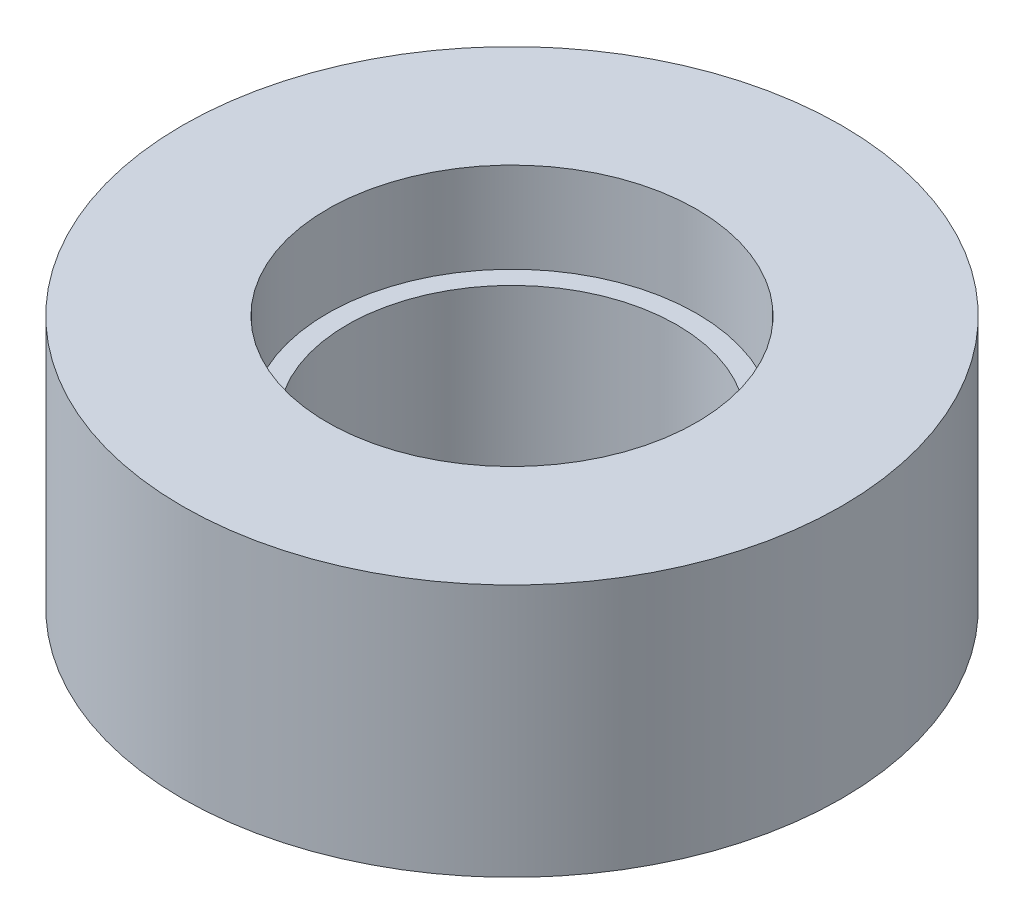
ISO-10303-21;
HEADER;
FILE_DESCRIPTION(('STEP AP214'),'2;1');
FILE_NAME('part.step','',(''),(''),'','','');
FILE_SCHEMA(('AUTOMOTIVE_DESIGN { 1 0 10303 214 1 1 1 1 }'));
ENDSEC;
DATA;
#1=APPLICATION_CONTEXT('core data for automotive mechanical design processes');
#2=APPLICATION_PROTOCOL_DEFINITION('international standard','automotive_design',2000,#1);
#3=PRODUCT_CONTEXT('',#1,'mechanical');
#4=PRODUCT('Part','Part','',(#3));
#5=PRODUCT_RELATED_PRODUCT_CATEGORY('part','',(#4));
#6=PRODUCT_DEFINITION_FORMATION('','',#4);
#7=PRODUCT_DEFINITION_CONTEXT('part definition',#1,'design');
#8=PRODUCT_DEFINITION('design','',#6,#7);
#9=PRODUCT_DEFINITION_SHAPE('','',#8);
#10=(LENGTH_UNIT() NAMED_UNIT(*) SI_UNIT(.MILLI.,.METRE.));
#11=(NAMED_UNIT(*) PLANE_ANGLE_UNIT() SI_UNIT($,.RADIAN.));
#12=(NAMED_UNIT(*) SI_UNIT($,.STERADIAN.) SOLID_ANGLE_UNIT());
#13=UNCERTAINTY_MEASURE_WITH_UNIT(LENGTH_MEASURE(1.E-05),#10,'distance_accuracy_value','');
#14=(GEOMETRIC_REPRESENTATION_CONTEXT(3) GLOBAL_UNCERTAINTY_ASSIGNED_CONTEXT((#13)) GLOBAL_UNIT_ASSIGNED_CONTEXT((#10,
#11,#12)) REPRESENTATION_CONTEXT('',''));
#15=CARTESIAN_POINT('',(0.,0.,0.));
#16=DIRECTION('',(0.,0.,1.));
#17=DIRECTION('',(1.,0.,0.));
#18=AXIS2_PLACEMENT_3D('',#15,#16,#17);
#19=CARTESIAN_POINT('',(0.,12.192,15.875));
#20=DIRECTION('',(0.,-1.,0.));
#21=DIRECTION('',(0.,0.,-1.));
#22=AXIS2_PLACEMENT_3D('',#19,#20,#21);
#23=PLANE('',#22);
#24=CARTESIAN_POINT('',(0.,12.192,0.));
#25=DIRECTION('',(0.,-1.,0.));
#26=DIRECTION('',(0.,0.,-1.));
#27=AXIS2_PLACEMENT_3D('',#24,#25,#26);
#28=CIRCLE('',#27,15.875);
#29=CARTESIAN_POINT('',(0.,12.192,-15.875));
#30=VERTEX_POINT('',#29);
#31=EDGE_CURVE('E65',#30,#30,#28,.T.);
#32=ORIENTED_EDGE('',*,*,#31,.F.);
#33=EDGE_LOOP('',(#32));
#34=FACE_BOUND('',#33,.T.);
#35=CARTESIAN_POINT('',(0.,12.192,0.));
#36=DIRECTION('',(0.,-1.,0.));
#37=DIRECTION('',(0.,0.,-1.));
#38=AXIS2_PLACEMENT_3D('',#35,#36,#37);
#39=CIRCLE('',#38,8.89);
#40=CARTESIAN_POINT('',(0.,12.192,-8.89));
#41=VERTEX_POINT('',#40);
#42=EDGE_CURVE('E12',#41,#41,#39,.T.);
#43=ORIENTED_EDGE('',*,*,#42,.T.);
#44=EDGE_LOOP('',(#43));
#45=FACE_BOUND('',#44,.T.);
#46=ADVANCED_FACE('F43',(#34,#45),#23,.F.);
#47=CARTESIAN_POINT('',(0.,0.,0.));
#48=DIRECTION('',(0.,-1.,0.));
#49=DIRECTION('',(0.,0.,-1.));
#50=AXIS2_PLACEMENT_3D('',#47,#48,#49);
#51=CYLINDRICAL_SURFACE('',#50,8.89);
#52=ORIENTED_EDGE('',*,*,#42,.F.);
#53=EDGE_LOOP('',(#52));
#54=FACE_BOUND('',#53,.T.);
#55=CARTESIAN_POINT('',(0.,7.8486,0.));
#56=DIRECTION('',(0.,-1.,0.));
#57=DIRECTION('',(0.,0.,-1.));
#58=AXIS2_PLACEMENT_3D('',#55,#56,#57);
#59=CIRCLE('',#58,8.89);
#60=CARTESIAN_POINT('',(0.,7.8486,-8.89));
#61=VERTEX_POINT('',#60);
#62=EDGE_CURVE('E49',#61,#61,#59,.T.);
#63=ORIENTED_EDGE('',*,*,#62,.T.);
#64=EDGE_LOOP('',(#63));
#65=FACE_BOUND('',#64,.T.);
#66=ADVANCED_FACE('F72',(#54,#65),#51,.F.);
#67=CARTESIAN_POINT('',(0.,7.8486,8.89));
#68=DIRECTION('',(0.,-1.,0.));
#69=DIRECTION('',(0.,0.,-1.));
#70=AXIS2_PLACEMENT_3D('',#67,#68,#69);
#71=PLANE('',#70);
#72=ORIENTED_EDGE('',*,*,#62,.F.);
#73=EDGE_LOOP('',(#72));
#74=FACE_BOUND('',#73,.T.);
#75=CARTESIAN_POINT('',(0.,7.8486,0.));
#76=DIRECTION('',(0.,-1.,0.));
#77=DIRECTION('',(0.,0.,-1.));
#78=AXIS2_PLACEMENT_3D('',#75,#76,#77);
#79=CIRCLE('',#78,7.9375);
#80=CARTESIAN_POINT('',(0.,7.8486,-7.9375));
#81=VERTEX_POINT('',#80);
#82=EDGE_CURVE('E53',#81,#81,#79,.T.);
#83=ORIENTED_EDGE('',*,*,#82,.T.);
#84=EDGE_LOOP('',(#83));
#85=FACE_BOUND('',#84,.T.);
#86=ADVANCED_FACE('F76',(#74,#85),#71,.F.);
#87=CARTESIAN_POINT('',(0.,0.,0.));
#88=DIRECTION('',(0.,-1.,0.));
#89=DIRECTION('',(0.,0.,-1.));
#90=AXIS2_PLACEMENT_3D('',#87,#88,#89);
#91=CYLINDRICAL_SURFACE('',#90,7.9375);
#92=ORIENTED_EDGE('',*,*,#82,.F.);
#93=EDGE_LOOP('',(#92));
#94=FACE_BOUND('',#93,.T.);
#95=CARTESIAN_POINT('',(0.,0.,0.));
#96=DIRECTION('',(0.,-1.,0.));
#97=DIRECTION('',(0.,0.,-1.));
#98=AXIS2_PLACEMENT_3D('',#95,#96,#97);
#99=CIRCLE('',#98,7.9375);
#100=CARTESIAN_POINT('',(0.,0.,-7.9375));
#101=VERTEX_POINT('',#100);
#102=EDGE_CURVE('E57',#101,#101,#99,.T.);
#103=ORIENTED_EDGE('',*,*,#102,.T.);
#104=EDGE_LOOP('',(#103));
#105=FACE_BOUND('',#104,.T.);
#106=ADVANCED_FACE('F81',(#94,#105),#91,.F.);
#107=CARTESIAN_POINT('',(0.,0.,15.875));
#108=DIRECTION('',(0.,1.,0.));
#109=DIRECTION('',(0.,0.,1.));
#110=AXIS2_PLACEMENT_3D('',#107,#108,#109);
#111=PLANE('',#110);
#112=ORIENTED_EDGE('',*,*,#102,.F.);
#113=EDGE_LOOP('',(#112));
#114=FACE_BOUND('',#113,.T.);
#115=CARTESIAN_POINT('',(0.,0.,0.));
#116=DIRECTION('',(0.,-1.,0.));
#117=DIRECTION('',(0.,0.,-1.));
#118=AXIS2_PLACEMENT_3D('',#115,#116,#117);
#119=CIRCLE('',#118,15.875);
#120=CARTESIAN_POINT('',(0.,0.,-15.875));
#121=VERTEX_POINT('',#120);
#122=EDGE_CURVE('E62',#121,#121,#119,.T.);
#123=ORIENTED_EDGE('',*,*,#122,.T.);
#124=EDGE_LOOP('',(#123));
#125=FACE_BOUND('',#124,.T.);
#126=ADVANCED_FACE('F87',(#114,#125),#111,.F.);
#127=CARTESIAN_POINT('',(0.,0.,0.));
#128=DIRECTION('',(0.,-1.,0.));
#129=DIRECTION('',(0.,0.,-1.));
#130=AXIS2_PLACEMENT_3D('',#127,#128,#129);
#131=CYLINDRICAL_SURFACE('',#130,15.875);
#132=ORIENTED_EDGE('',*,*,#122,.F.);
#133=EDGE_LOOP('',(#132));
#134=FACE_BOUND('',#133,.T.);
#135=ORIENTED_EDGE('',*,*,#31,.T.);
#136=EDGE_LOOP('',(#135));
#137=FACE_BOUND('',#136,.T.);
#138=ADVANCED_FACE('F69',(#134,#137),#131,.T.);
#139=CLOSED_SHELL('',(#46,#66,#86,#106,#126,#138));
#140=MANIFOLD_SOLID_BREP('B2',#139);
#141=ADVANCED_BREP_SHAPE_REPRESENTATION('',(#18,#140),#14);
#142=SHAPE_DEFINITION_REPRESENTATION(#9,#141);
ENDSEC;
END-ISO-10303-21;
